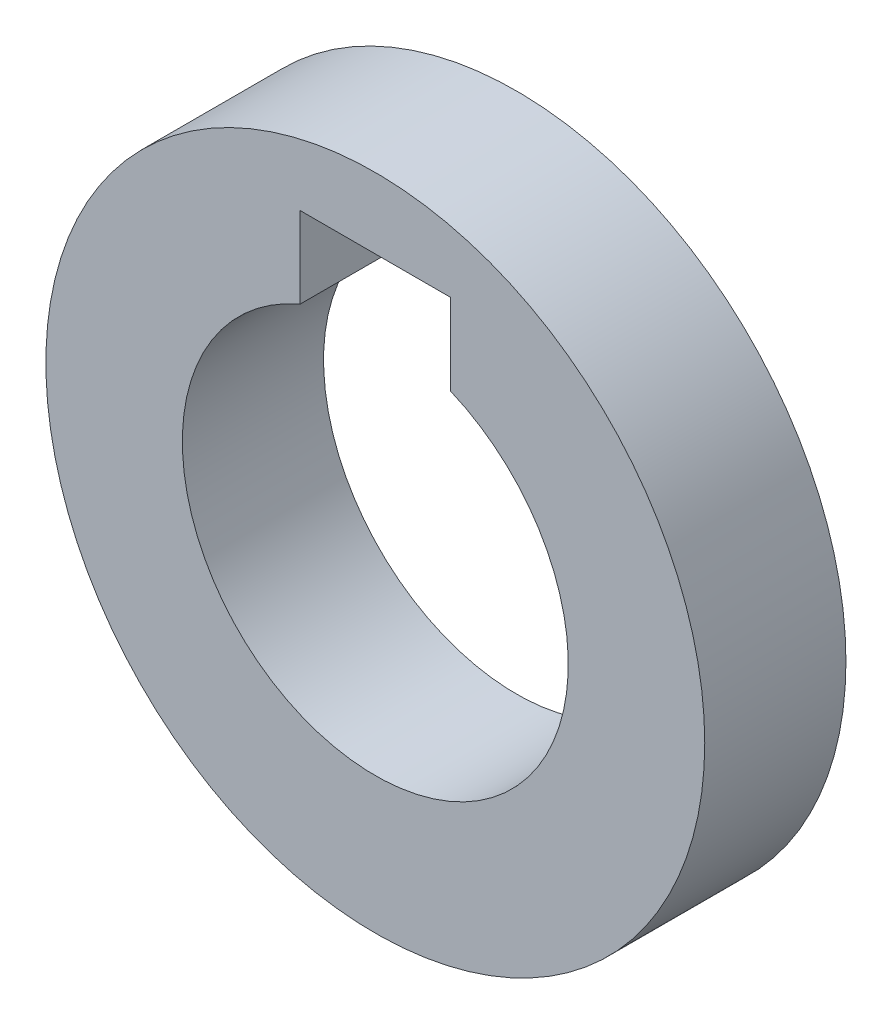
ISO-10303-21;
HEADER;
FILE_DESCRIPTION(('STEP AP214'),'2;1');
FILE_NAME('part.step','',(''),(''),'','','');
FILE_SCHEMA(('AUTOMOTIVE_DESIGN { 1 0 10303 214 1 1 1 1 }'));
ENDSEC;
DATA;
#1=APPLICATION_CONTEXT('core data for automotive mechanical design processes');
#2=APPLICATION_PROTOCOL_DEFINITION('international standard','automotive_design',2000,#1);
#3=PRODUCT_CONTEXT('',#1,'mechanical');
#4=PRODUCT('Part','Part','',(#3));
#5=PRODUCT_RELATED_PRODUCT_CATEGORY('part','',(#4));
#6=PRODUCT_DEFINITION_FORMATION('','',#4);
#7=PRODUCT_DEFINITION_CONTEXT('part definition',#1,'design');
#8=PRODUCT_DEFINITION('design','',#6,#7);
#9=PRODUCT_DEFINITION_SHAPE('','',#8);
#10=(LENGTH_UNIT() NAMED_UNIT(*) SI_UNIT(.MILLI.,.METRE.));
#11=(NAMED_UNIT(*) PLANE_ANGLE_UNIT() SI_UNIT($,.RADIAN.));
#12=(NAMED_UNIT(*) SI_UNIT($,.STERADIAN.) SOLID_ANGLE_UNIT());
#13=UNCERTAINTY_MEASURE_WITH_UNIT(LENGTH_MEASURE(1.E-05),#10,'distance_accuracy_value','');
#14=(GEOMETRIC_REPRESENTATION_CONTEXT(3) GLOBAL_UNCERTAINTY_ASSIGNED_CONTEXT((#13)) GLOBAL_UNIT_ASSIGNED_CONTEXT((#10,
#11,#12)) REPRESENTATION_CONTEXT('',''));
#15=CARTESIAN_POINT('',(0.,0.,0.));
#16=DIRECTION('',(0.,0.,1.));
#17=DIRECTION('',(1.,0.,0.));
#18=AXIS2_PLACEMENT_3D('',#15,#16,#17);
#19=CARTESIAN_POINT('',(0.,0.,3.));
#20=DIRECTION('',(0.,0.,1.));
#21=DIRECTION('',(1.,0.,0.));
#22=AXIS2_PLACEMENT_3D('',#19,#20,#21);
#23=PLANE('',#22);
#24=CARTESIAN_POINT('',(0.,0.,3.));
#25=DIRECTION('',(0.,0.,1.));
#26=DIRECTION('',(1.,0.,0.));
#27=AXIS2_PLACEMENT_3D('',#24,#25,#26);
#28=CIRCLE('',#27,7.);
#29=CARTESIAN_POINT('',(7.,0.,3.));
#30=VERTEX_POINT('',#29);
#31=EDGE_CURVE('E11',#30,#30,#28,.T.);
#32=ORIENTED_EDGE('',*,*,#31,.T.);
#33=EDGE_LOOP('',(#32));
#34=FACE_BOUND('',#33,.T.);
#35=DIRECTION('',(0.,1.,0.));
#36=VECTOR('',#35,1.);
#37=CARTESIAN_POINT('',(1.6,5.5,3.));
#38=LINE('',#37,#36);
#39=CARTESIAN_POINT('',(1.6,3.77491721763537,3.));
#40=VERTEX_POINT('',#39);
#41=CARTESIAN_POINT('',(1.6,5.5,3.));
#42=VERTEX_POINT('',#41);
#43=EDGE_CURVE('E84',#40,#42,#38,.T.);
#44=ORIENTED_EDGE('',*,*,#43,.F.);
#45=CARTESIAN_POINT('',(0.,0.,3.));
#46=DIRECTION('',(0.,0.,1.));
#47=DIRECTION('',(1.,0.,0.));
#48=AXIS2_PLACEMENT_3D('',#45,#46,#47);
#49=CIRCLE('',#48,4.1);
#50=CARTESIAN_POINT('',(-1.6,3.77491721763537,3.));
#51=VERTEX_POINT('',#50);
#52=EDGE_CURVE('E76',#51,#40,#49,.T.);
#53=ORIENTED_EDGE('',*,*,#52,.F.);
#54=DIRECTION('',(0.,-1.,0.));
#55=VECTOR('',#54,1.);
#56=CARTESIAN_POINT('',(-1.6,3.77491721763537,3.));
#57=LINE('',#56,#55);
#58=CARTESIAN_POINT('',(-1.6,5.5,3.));
#59=VERTEX_POINT('',#58);
#60=EDGE_CURVE('E97',#59,#51,#57,.T.);
#61=ORIENTED_EDGE('',*,*,#60,.F.);
#62=DIRECTION('',(-1.,0.,0.));
#63=VECTOR('',#62,1.);
#64=CARTESIAN_POINT('',(-1.6,5.5,3.));
#65=LINE('',#64,#63);
#66=EDGE_CURVE('E95',#42,#59,#65,.T.);
#67=ORIENTED_EDGE('',*,*,#66,.F.);
#68=EDGE_LOOP('',(#44,#53,#61,#67));
#69=FACE_BOUND('',#68,.T.);
#70=ADVANCED_FACE('F35',(#34,#69),#23,.T.);
#71=CARTESIAN_POINT('',(0.,0.,0.));
#72=DIRECTION('',(0.,0.,1.));
#73=DIRECTION('',(1.,0.,0.));
#74=AXIS2_PLACEMENT_3D('',#71,#72,#73);
#75=PLANE('',#74);
#76=CARTESIAN_POINT('',(0.,0.,0.));
#77=DIRECTION('',(0.,0.,1.));
#78=DIRECTION('',(1.,0.,0.));
#79=AXIS2_PLACEMENT_3D('',#76,#77,#78);
#80=CIRCLE('',#79,7.);
#81=CARTESIAN_POINT('',(7.,0.,0.));
#82=VERTEX_POINT('',#81);
#83=EDGE_CURVE('E39',#82,#82,#80,.T.);
#84=ORIENTED_EDGE('',*,*,#83,.F.);
#85=EDGE_LOOP('',(#84));
#86=FACE_BOUND('',#85,.T.);
#87=CARTESIAN_POINT('',(0.,0.,0.));
#88=DIRECTION('',(0.,0.,1.));
#89=DIRECTION('',(1.,0.,0.));
#90=AXIS2_PLACEMENT_3D('',#87,#88,#89);
#91=CIRCLE('',#90,4.1);
#92=CARTESIAN_POINT('',(-1.6,3.77491721763537,0.));
#93=VERTEX_POINT('',#92);
#94=CARTESIAN_POINT('',(1.6,3.77491721763537,0.));
#95=VERTEX_POINT('',#94);
#96=EDGE_CURVE('E58',#93,#95,#91,.T.);
#97=ORIENTED_EDGE('',*,*,#96,.T.);
#98=DIRECTION('',(0.,1.,0.));
#99=VECTOR('',#98,1.);
#100=CARTESIAN_POINT('',(1.6,5.5,0.));
#101=LINE('',#100,#99);
#102=CARTESIAN_POINT('',(1.6,5.5,0.));
#103=VERTEX_POINT('',#102);
#104=EDGE_CURVE('E91',#95,#103,#101,.T.);
#105=ORIENTED_EDGE('',*,*,#104,.T.);
#106=DIRECTION('',(-1.,0.,0.));
#107=VECTOR('',#106,1.);
#108=CARTESIAN_POINT('',(-1.6,5.5,0.));
#109=LINE('',#108,#107);
#110=CARTESIAN_POINT('',(-1.6,5.5,0.));
#111=VERTEX_POINT('',#110);
#112=EDGE_CURVE('E103',#103,#111,#109,.T.);
#113=ORIENTED_EDGE('',*,*,#112,.T.);
#114=DIRECTION('',(0.,-1.,0.));
#115=VECTOR('',#114,1.);
#116=CARTESIAN_POINT('',(-1.6,3.77491721763537,0.));
#117=LINE('',#116,#115);
#118=EDGE_CURVE('E85',#111,#93,#117,.T.);
#119=ORIENTED_EDGE('',*,*,#118,.T.);
#120=EDGE_LOOP('',(#97,#105,#113,#119));
#121=FACE_BOUND('',#120,.T.);
#122=ADVANCED_FACE('F114',(#86,#121),#75,.F.);
#123=CARTESIAN_POINT('',(0.,0.,3.));
#124=DIRECTION('',(0.,0.,-1.));
#125=DIRECTION('',(-1.,0.,0.));
#126=AXIS2_PLACEMENT_3D('',#123,#124,#125);
#127=CYLINDRICAL_SURFACE('',#126,7.);
#128=ORIENTED_EDGE('',*,*,#31,.F.);
#129=EDGE_LOOP('',(#128));
#130=FACE_BOUND('',#129,.T.);
#131=ORIENTED_EDGE('',*,*,#83,.T.);
#132=EDGE_LOOP('',(#131));
#133=FACE_BOUND('',#132,.T.);
#134=ADVANCED_FACE('F37',(#130,#133),#127,.T.);
#135=CARTESIAN_POINT('',(0.,0.,3.));
#136=DIRECTION('',(0.,0.,-1.));
#137=DIRECTION('',(-1.,0.,0.));
#138=AXIS2_PLACEMENT_3D('',#135,#136,#137);
#139=CYLINDRICAL_SURFACE('',#138,4.1);
#140=ORIENTED_EDGE('',*,*,#96,.F.);
#141=DIRECTION('',(0.,0.,-1.));
#142=VECTOR('',#141,1.);
#143=CARTESIAN_POINT('',(-1.6,3.77491721763537,3.));
#144=LINE('',#143,#142);
#145=EDGE_CURVE('E80',#51,#93,#144,.T.);
#146=ORIENTED_EDGE('',*,*,#145,.F.);
#147=ORIENTED_EDGE('',*,*,#52,.T.);
#148=DIRECTION('',(0.,0.,-1.));
#149=VECTOR('',#148,1.);
#150=CARTESIAN_POINT('',(1.6,3.77491721763537,3.));
#151=LINE('',#150,#149);
#152=EDGE_CURVE('E79',#40,#95,#151,.T.);
#153=ORIENTED_EDGE('',*,*,#152,.T.);
#154=EDGE_LOOP('',(#140,#146,#147,#153));
#155=FACE_BOUND('',#154,.T.);
#156=ADVANCED_FACE('F78',(#155),#139,.F.);
#157=CARTESIAN_POINT('',(1.6,5.5,3.));
#158=DIRECTION('',(-1.,0.,0.));
#159=DIRECTION('',(0.,0.,1.));
#160=AXIS2_PLACEMENT_3D('',#157,#158,#159);
#161=PLANE('',#160);
#162=ORIENTED_EDGE('',*,*,#104,.F.);
#163=ORIENTED_EDGE('',*,*,#152,.F.);
#164=ORIENTED_EDGE('',*,*,#43,.T.);
#165=DIRECTION('',(0.,0.,-1.));
#166=VECTOR('',#165,1.);
#167=CARTESIAN_POINT('',(1.6,5.5,3.));
#168=LINE('',#167,#166);
#169=EDGE_CURVE('E92',#42,#103,#168,.T.);
#170=ORIENTED_EDGE('',*,*,#169,.T.);
#171=EDGE_LOOP('',(#162,#163,#164,#170));
#172=FACE_BOUND('',#171,.T.);
#173=ADVANCED_FACE('F88',(#172),#161,.T.);
#174=CARTESIAN_POINT('',(-1.6,5.5,3.));
#175=DIRECTION('',(0.,-1.,0.));
#176=DIRECTION('',(0.,0.,-1.));
#177=AXIS2_PLACEMENT_3D('',#174,#175,#176);
#178=PLANE('',#177);
#179=ORIENTED_EDGE('',*,*,#112,.F.);
#180=ORIENTED_EDGE('',*,*,#169,.F.);
#181=ORIENTED_EDGE('',*,*,#66,.T.);
#182=DIRECTION('',(0.,0.,-1.));
#183=VECTOR('',#182,1.);
#184=CARTESIAN_POINT('',(-1.6,5.5,3.));
#185=LINE('',#184,#183);
#186=EDGE_CURVE('E50',#59,#111,#185,.T.);
#187=ORIENTED_EDGE('',*,*,#186,.T.);
#188=EDGE_LOOP('',(#179,#180,#181,#187));
#189=FACE_BOUND('',#188,.T.);
#190=ADVANCED_FACE('F112',(#189),#178,.T.);
#191=CARTESIAN_POINT('',(-1.6,3.77491721763537,3.));
#192=DIRECTION('',(1.,0.,0.));
#193=DIRECTION('',(0.,0.,-1.));
#194=AXIS2_PLACEMENT_3D('',#191,#192,#193);
#195=PLANE('',#194);
#196=ORIENTED_EDGE('',*,*,#118,.F.);
#197=ORIENTED_EDGE('',*,*,#186,.F.);
#198=ORIENTED_EDGE('',*,*,#60,.T.);
#199=ORIENTED_EDGE('',*,*,#145,.T.);
#200=EDGE_LOOP('',(#196,#197,#198,#199));
#201=FACE_BOUND('',#200,.T.);
#202=ADVANCED_FACE('F115',(#201),#195,.T.);
#203=CLOSED_SHELL('',(#70,#122,#134,#156,#173,#190,#202));
#204=MANIFOLD_SOLID_BREP('B2',#203);
#205=ADVANCED_BREP_SHAPE_REPRESENTATION('',(#18,#204),#14);
#206=SHAPE_DEFINITION_REPRESENTATION(#9,#205);
ENDSEC;
END-ISO-10303-21;
